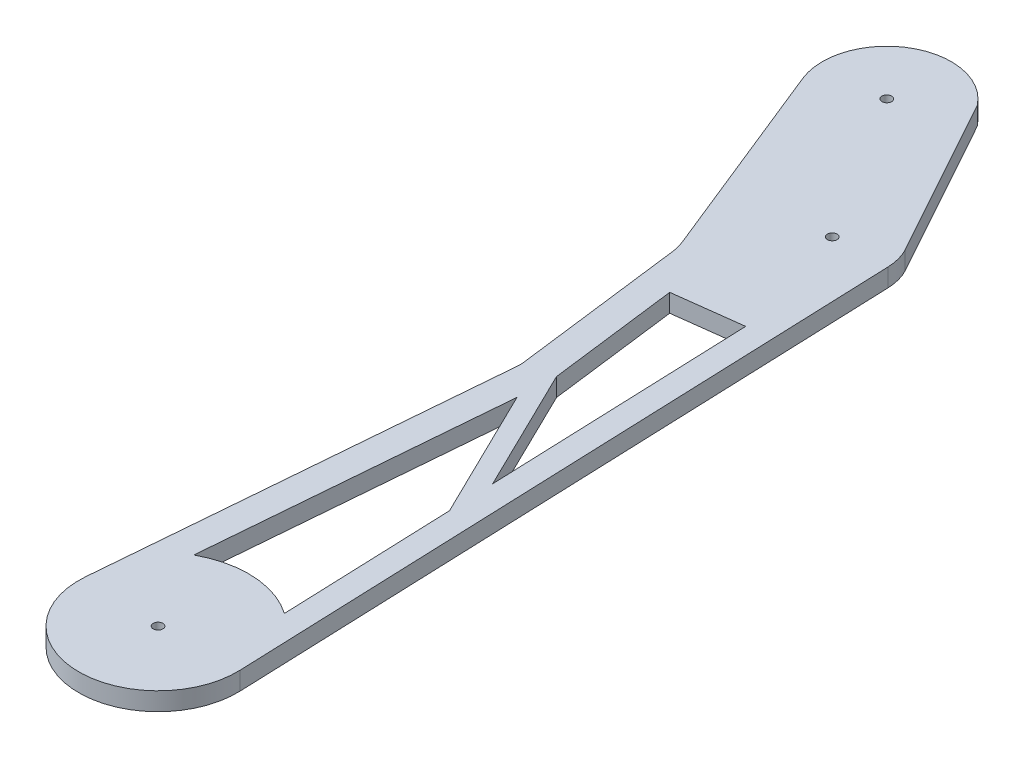
ISO-10303-21;
HEADER;
FILE_DESCRIPTION(('STEP AP214'),'2;1');
FILE_NAME('part.step','',(''),(''),'','','');
FILE_SCHEMA(('AUTOMOTIVE_DESIGN { 1 0 10303 214 1 1 1 1 }'));
ENDSEC;
DATA;
#1=APPLICATION_CONTEXT('core data for automotive mechanical design processes');
#2=APPLICATION_PROTOCOL_DEFINITION('international standard','automotive_design',2000,#1);
#3=PRODUCT_CONTEXT('',#1,'mechanical');
#4=PRODUCT('Part','Part','',(#3));
#5=PRODUCT_RELATED_PRODUCT_CATEGORY('part','',(#4));
#6=PRODUCT_DEFINITION_FORMATION('','',#4);
#7=PRODUCT_DEFINITION_CONTEXT('part definition',#1,'design');
#8=PRODUCT_DEFINITION('design','',#6,#7);
#9=PRODUCT_DEFINITION_SHAPE('','',#8);
#10=(LENGTH_UNIT() NAMED_UNIT(*) SI_UNIT(.MILLI.,.METRE.));
#11=(NAMED_UNIT(*) PLANE_ANGLE_UNIT() SI_UNIT($,.RADIAN.));
#12=(NAMED_UNIT(*) SI_UNIT($,.STERADIAN.) SOLID_ANGLE_UNIT());
#13=UNCERTAINTY_MEASURE_WITH_UNIT(LENGTH_MEASURE(1.E-05),#10,'distance_accuracy_value','');
#14=(GEOMETRIC_REPRESENTATION_CONTEXT(3) GLOBAL_UNCERTAINTY_ASSIGNED_CONTEXT((#13)) GLOBAL_UNIT_ASSIGNED_CONTEXT((#10,
#11,#12)) REPRESENTATION_CONTEXT('',''));
#15=CARTESIAN_POINT('',(0.,0.,0.));
#16=DIRECTION('',(0.,0.,1.));
#17=DIRECTION('',(1.,0.,0.));
#18=AXIS2_PLACEMENT_3D('',#15,#16,#17);
#19=CARTESIAN_POINT('',(25.5027292155976,3.175,-10.2871835645262));
#20=DIRECTION('',(0.927393221665051,0.,-0.374087974158108));
#21=DIRECTION('',(-0.374087974158108,0.,-0.927393221665051));
#22=AXIS2_PLACEMENT_3D('',#19,#20,#21);
#23=PLANE('',#22);
#24=DIRECTION('',(0.374087974158108,0.,0.927393221665051));
#25=VECTOR('',#24,1.);
#26=CARTESIAN_POINT('',(25.5027292155976,0.,-10.2871835645262));
#27=LINE('',#26,#25);
#28=CARTESIAN_POINT('',(-26.6183550992122,0.,-139.499410736945));
#29=VERTEX_POINT('',#28);
#30=CARTESIAN_POINT('',(-12.3575467128305,0.,-104.145756124661));
#31=VERTEX_POINT('',#30);
#32=EDGE_CURVE('E254',#29,#31,#27,.T.);
#33=ORIENTED_EDGE('',*,*,#32,.T.);
#34=DIRECTION('',(0.,-1.,0.));
#35=VECTOR('',#34,1.);
#36=CARTESIAN_POINT('',(-12.3575467128305,3.175,-104.145756124661));
#37=LINE('',#36,#35);
#38=CARTESIAN_POINT('',(-12.3575467128305,3.175,-104.145756124661));
#39=VERTEX_POINT('',#38);
#40=EDGE_CURVE('E11',#39,#31,#37,.T.);
#41=ORIENTED_EDGE('',*,*,#40,.F.);
#42=DIRECTION('',(0.374087974158108,0.,0.927393221665051));
#43=VECTOR('',#42,1.);
#44=CARTESIAN_POINT('',(25.5027292155976,3.175,-10.2871835645262));
#45=LINE('',#44,#43);
#46=CARTESIAN_POINT('',(-26.6183550992122,3.175,-139.499410736945));
#47=VERTEX_POINT('',#46);
#48=EDGE_CURVE('E460',#47,#39,#45,.T.);
#49=ORIENTED_EDGE('',*,*,#48,.F.);
#50=DIRECTION('',(0.,-1.,0.));
#51=VECTOR('',#50,1.);
#52=CARTESIAN_POINT('',(-26.6183550992122,3.175,-139.499410736945));
#53=LINE('',#52,#51);
#54=EDGE_CURVE('E67',#47,#29,#53,.T.);
#55=ORIENTED_EDGE('',*,*,#54,.T.);
#56=EDGE_LOOP('',(#33,#41,#49,#55));
#57=FACE_BOUND('',#56,.T.);
#58=ADVANCED_FACE('F47',(#57),#23,.F.);
#59=CARTESIAN_POINT('',(-21.1520677234773,3.175,-100.598259257413));
#60=DIRECTION('',(0.,-1.,0.));
#61=DIRECTION('',(0.,0.,-1.));
#62=AXIS2_PLACEMENT_3D('',#59,#60,#61);
#63=CYLINDRICAL_SURFACE('',#62,9.48305508946575);
#64=CARTESIAN_POINT('',(-21.1520677234773,0.,-100.598259257413));
#65=DIRECTION('',(0.,1.,0.));
#66=DIRECTION('',(0.,0.,1.));
#67=AXIS2_PLACEMENT_3D('',#64,#65,#66);
#68=CIRCLE('',#67,9.48305508946575);
#69=CARTESIAN_POINT('',(-11.7435795270454,0.,-101.785139069123));
#70=VERTEX_POINT('',#69);
#71=EDGE_CURVE('E257',#31,#70,#68,.F.);
#72=ORIENTED_EDGE('',*,*,#71,.T.);
#73=DIRECTION('',(0.,-1.,0.));
#74=VECTOR('',#73,1.);
#75=CARTESIAN_POINT('',(-11.7435795270454,3.175,-101.785139069123));
#76=LINE('',#75,#74);
#77=CARTESIAN_POINT('',(-11.7435795270454,3.175,-101.785139069123));
#78=VERTEX_POINT('',#77);
#79=EDGE_CURVE('E58',#78,#70,#76,.T.);
#80=ORIENTED_EDGE('',*,*,#79,.F.);
#81=CARTESIAN_POINT('',(-21.1520677234773,3.175,-100.598259257413));
#82=DIRECTION('',(0.,1.,0.));
#83=DIRECTION('',(0.,0.,1.));
#84=AXIS2_PLACEMENT_3D('',#81,#82,#83);
#85=CIRCLE('',#84,9.48305508946575);
#86=EDGE_CURVE('E451',#39,#78,#85,.F.);
#87=ORIENTED_EDGE('',*,*,#86,.F.);
#88=ORIENTED_EDGE('',*,*,#40,.T.);
#89=EDGE_LOOP('',(#72,#80,#87,#88));
#90=FACE_BOUND('',#89,.T.);
#91=ADVANCED_FACE('F365',(#90),#63,.F.);
#92=CARTESIAN_POINT('',(1.07942743799077,3.175,-0.136169659525342));
#93=DIRECTION('',(0.992136828023214,0.,-0.125157958117078));
#94=DIRECTION('',(-0.125157958117078,0.,-0.992136828023214));
#95=AXIS2_PLACEMENT_3D('',#92,#93,#94);
#96=PLANE('',#95);
#97=DIRECTION('',(0.125157958117078,0.,0.992136828023214));
#98=VECTOR('',#97,1.);
#99=CARTESIAN_POINT('',(1.07942743799077,0.,-0.136169659525342));
#100=LINE('',#99,#98);
#101=CARTESIAN_POINT('',(-7.99527824016629,0.,-72.0720644457673));
#102=VERTEX_POINT('',#101);
#103=EDGE_CURVE('E260',#70,#102,#100,.T.);
#104=ORIENTED_EDGE('',*,*,#103,.T.);
#105=DIRECTION('',(0.,-1.,0.));
#106=VECTOR('',#105,1.);
#107=CARTESIAN_POINT('',(-7.99527824016629,3.175,-72.0720644457673));
#108=LINE('',#107,#106);
#109=CARTESIAN_POINT('',(-7.99527824016629,3.175,-72.0720644457673));
#110=VERTEX_POINT('',#109);
#111=EDGE_CURVE('E306',#110,#102,#108,.T.);
#112=ORIENTED_EDGE('',*,*,#111,.F.);
#113=DIRECTION('',(0.125157958117078,0.,0.992136828023214));
#114=VECTOR('',#113,1.);
#115=CARTESIAN_POINT('',(1.07942743799077,3.175,-0.136169659525342));
#116=LINE('',#115,#114);
#117=EDGE_CURVE('E445',#78,#110,#116,.T.);
#118=ORIENTED_EDGE('',*,*,#117,.F.);
#119=ORIENTED_EDGE('',*,*,#79,.T.);
#120=EDGE_LOOP('',(#104,#112,#118,#119));
#121=FACE_BOUND('',#120,.T.);
#122=ADVANCED_FACE('F370',(#121),#96,.F.);
#123=CARTESIAN_POINT('',(-14.2953470981137,3.175,-71.2773114117238));
#124=DIRECTION('',(0.,-1.,0.));
#125=DIRECTION('',(0.,0.,-1.));
#126=AXIS2_PLACEMENT_3D('',#123,#124,#125);
#127=CYLINDRICAL_SURFACE('',#126,6.35);
#128=CARTESIAN_POINT('',(-14.2953470981137,0.,-71.2773114117238));
#129=DIRECTION('',(0.,1.,0.));
#130=DIRECTION('',(0.,0.,1.));
#131=AXIS2_PLACEMENT_3D('',#128,#129,#130);
#132=CIRCLE('',#131,6.35);
#133=CARTESIAN_POINT('',(-7.96771141316416,0.,-70.7448392166252));
#134=VERTEX_POINT('',#133);
#135=EDGE_CURVE('E264',#134,#102,#132,.T.);
#136=ORIENTED_EDGE('',*,*,#135,.F.);
#137=DIRECTION('',(0.,-1.,0.));
#138=VECTOR('',#137,1.);
#139=CARTESIAN_POINT('',(-7.96771141316416,3.175,-70.7448392166252));
#140=LINE('',#139,#138);
#141=CARTESIAN_POINT('',(-7.96771141316416,3.175,-70.7448392166252));
#142=VERTEX_POINT('',#141);
#143=EDGE_CURVE('E303',#142,#134,#140,.T.);
#144=ORIENTED_EDGE('',*,*,#143,.F.);
#145=CARTESIAN_POINT('',(-14.2953470981137,3.175,-71.2773114117238));
#146=DIRECTION('',(0.,1.,0.));
#147=DIRECTION('',(0.,0.,1.));
#148=AXIS2_PLACEMENT_3D('',#145,#146,#147);
#149=CIRCLE('',#148,6.35);
#150=EDGE_CURVE('E442',#142,#110,#149,.T.);
#151=ORIENTED_EDGE('',*,*,#150,.T.);
#152=ORIENTED_EDGE('',*,*,#111,.T.);
#153=EDGE_LOOP('',(#136,#144,#151,#152));
#154=FACE_BOUND('',#153,.T.);
#155=ADVANCED_FACE('F423',(#154),#127,.F.);
#156=CARTESIAN_POINT('',(-13.82302359231,3.175,-1.16321104462518));
#157=DIRECTION('',(0.996478060621975,0.,0.0838538889919131));
#158=DIRECTION('',(0.0838538889919131,0.,-0.996478060621975));
#159=AXIS2_PLACEMENT_3D('',#156,#157,#158);
#160=PLANE('',#159);
#161=DIRECTION('',(-0.083853888991913,0.,0.996478060621975));
#162=VECTOR('',#161,1.);
#163=CARTESIAN_POINT('',(-13.82302359231,0.,-1.16321104462518));
#164=LINE('',#163,#162);
#165=CARTESIAN_POINT('',(-13.82302359231,0.,-1.16321104462518));
#166=VERTEX_POINT('',#165);
#167=EDGE_CURVE('E268',#134,#166,#164,.T.);
#168=ORIENTED_EDGE('',*,*,#167,.T.);
#169=DIRECTION('',(0.,-1.,0.));
#170=VECTOR('',#169,1.);
#171=CARTESIAN_POINT('',(-13.82302359231,3.175,-1.16321104462518));
#172=LINE('',#171,#170);
#173=CARTESIAN_POINT('',(-13.82302359231,3.175,-1.16321104462518));
#174=VERTEX_POINT('',#173);
#175=EDGE_CURVE('E299',#174,#166,#172,.T.);
#176=ORIENTED_EDGE('',*,*,#175,.F.);
#177=DIRECTION('',(-0.083853888991913,0.,0.996478060621975));
#178=VECTOR('',#177,1.);
#179=CARTESIAN_POINT('',(-13.82302359231,3.175,-1.16321104462518));
#180=LINE('',#179,#178);
#181=EDGE_CURVE('E444',#142,#174,#180,.T.);
#182=ORIENTED_EDGE('',*,*,#181,.F.);
#183=ORIENTED_EDGE('',*,*,#143,.T.);
#184=EDGE_LOOP('',(#168,#176,#182,#183));
#185=FACE_BOUND('',#184,.T.);
#186=ADVANCED_FACE('F419',(#185),#160,.F.);
#187=CARTESIAN_POINT('',(0.,3.175,0.));
#188=DIRECTION('',(0.,-1.,0.));
#189=DIRECTION('',(0.,0.,-1.));
#190=AXIS2_PLACEMENT_3D('',#187,#188,#189);
#191=CYLINDRICAL_SURFACE('',#190,13.871879511007);
#192=CARTESIAN_POINT('',(0.,0.,0.));
#193=DIRECTION('',(0.,1.,0.));
#194=DIRECTION('',(0.,0.,1.));
#195=AXIS2_PLACEMENT_3D('',#192,#193,#194);
#196=CIRCLE('',#195,13.871879511007);
#197=CARTESIAN_POINT('',(13.8621224142897,0.,-0.520195481662794));
#198=VERTEX_POINT('',#197);
#199=EDGE_CURVE('E271',#166,#198,#196,.T.);
#200=ORIENTED_EDGE('',*,*,#199,.T.);
#201=DIRECTION('',(0.,-1.,0.));
#202=VECTOR('',#201,1.);
#203=CARTESIAN_POINT('',(13.8621224142897,3.175,-0.520195481662794));
#204=LINE('',#203,#202);
#205=CARTESIAN_POINT('',(13.8621224142897,3.175,-0.520195481662794));
#206=VERTEX_POINT('',#205);
#207=EDGE_CURVE('E296',#206,#198,#204,.T.);
#208=ORIENTED_EDGE('',*,*,#207,.F.);
#209=CARTESIAN_POINT('',(0.,3.175,0.));
#210=DIRECTION('',(0.,1.,0.));
#211=DIRECTION('',(0.,0.,1.));
#212=AXIS2_PLACEMENT_3D('',#209,#210,#211);
#213=CIRCLE('',#212,13.871879511007);
#214=EDGE_CURVE('E449',#174,#206,#213,.T.);
#215=ORIENTED_EDGE('',*,*,#214,.F.);
#216=ORIENTED_EDGE('',*,*,#175,.T.);
#217=EDGE_LOOP('',(#200,#208,#215,#216));
#218=FACE_BOUND('',#217,.T.);
#219=ADVANCED_FACE('F415',(#218),#191,.T.);
#220=CARTESIAN_POINT('',(13.8621224142897,3.175,-0.520195481662794));
#221=DIRECTION('',(0.999296627633657,0.,-0.0375000000000022));
#222=DIRECTION('',(-0.0375000000000022,0.,-0.999296627633657));
#223=AXIS2_PLACEMENT_3D('',#220,#221,#222);
#224=PLANE('',#223);
#225=DIRECTION('',(0.0375000000000022,0.,0.999296627633657));
#226=VECTOR('',#225,1.);
#227=CARTESIAN_POINT('',(13.8621224142897,0.,-0.520195481662794));
#228=LINE('',#227,#226);
#229=CARTESIAN_POINT('',(9.4394116017196,0.,-118.376195481663));
#230=VERTEX_POINT('',#229);
#231=EDGE_CURVE('E275',#230,#198,#228,.T.);
#232=ORIENTED_EDGE('',*,*,#231,.F.);
#233=DIRECTION('',(0.,-1.,0.));
#234=VECTOR('',#233,1.);
#235=CARTESIAN_POINT('',(9.4394116017196,3.175,-118.376195481663));
#236=LINE('',#235,#234);
#237=CARTESIAN_POINT('',(9.4394116017196,3.175,-118.376195481663));
#238=VERTEX_POINT('',#237);
#239=EDGE_CURVE('E192',#238,#230,#236,.T.);
#240=ORIENTED_EDGE('',*,*,#239,.F.);
#241=DIRECTION('',(0.0375000000000022,0.,0.999296627633657));
#242=VECTOR('',#241,1.);
#243=CARTESIAN_POINT('',(13.8621224142897,3.175,-0.520195481662794));
#244=LINE('',#243,#242);
#245=EDGE_CURVE('E202',#238,#206,#244,.T.);
#246=ORIENTED_EDGE('',*,*,#245,.T.);
#247=ORIENTED_EDGE('',*,*,#207,.T.);
#248=EDGE_LOOP('',(#232,#240,#246,#247));
#249=FACE_BOUND('',#248,.T.);
#250=ADVANCED_FACE('F412',(#249),#224,.T.);
#251=CARTESIAN_POINT('',(0.,3.175,-118.021968393053));
#252=DIRECTION('',(0.,-1.,0.));
#253=DIRECTION('',(0.,0.,-1.));
#254=AXIS2_PLACEMENT_3D('',#251,#252,#253);
#255=CYLINDRICAL_SURFACE('',#254,9.44605569626729);
#256=CARTESIAN_POINT('',(0.,0.,-118.021968393053));
#257=DIRECTION('',(0.,1.,0.));
#258=DIRECTION('',(0.,0.,1.));
#259=AXIS2_PLACEMENT_3D('',#256,#257,#258);
#260=CIRCLE('',#259,9.44605569626729);
#261=CARTESIAN_POINT('',(8.36793241451558,0.,-122.404396409927));
#262=VERTEX_POINT('',#261);
#263=EDGE_CURVE('E187',#262,#230,#260,.F.);
#264=ORIENTED_EDGE('',*,*,#263,.F.);
#265=DIRECTION('',(0.,-1.,0.));
#266=VECTOR('',#265,1.);
#267=CARTESIAN_POINT('',(8.36793241451558,3.175,-122.404396409927));
#268=LINE('',#267,#266);
#269=CARTESIAN_POINT('',(8.36793241451558,3.175,-122.404396409927));
#270=VERTEX_POINT('',#269);
#271=EDGE_CURVE('E182',#270,#262,#268,.T.);
#272=ORIENTED_EDGE('',*,*,#271,.F.);
#273=CARTESIAN_POINT('',(0.,3.175,-118.021968393053));
#274=DIRECTION('',(0.,1.,0.));
#275=DIRECTION('',(0.,0.,1.));
#276=AXIS2_PLACEMENT_3D('',#273,#274,#275);
#277=CIRCLE('',#276,9.44605569626729);
#278=EDGE_CURVE('E185',#270,#238,#277,.F.);
#279=ORIENTED_EDGE('',*,*,#278,.T.);
#280=ORIENTED_EDGE('',*,*,#239,.T.);
#281=EDGE_LOOP('',(#264,#272,#279,#280));
#282=FACE_BOUND('',#281,.T.);
#283=ADVANCED_FACE('F184',(#282),#255,.T.);
#284=CARTESIAN_POINT('',(58.2403035348906,3.175,-32.2000080624195));
#285=DIRECTION('',(0.875148788818419,0.,-0.483853900913957));
#286=DIRECTION('',(-0.483853900913957,0.,-0.875148788818419));
#287=AXIS2_PLACEMENT_3D('',#284,#285,#286);
#288=PLANE('',#287);
#289=DIRECTION('',(0.483853900913957,0.,0.875148788818419));
#290=VECTOR('',#289,1.);
#291=CARTESIAN_POINT('',(58.2403035348906,0.,-32.2000080624195));
#292=LINE('',#291,#290);
#293=CARTESIAN_POINT('',(-7.27820625378067,0.,-150.703639795958));
#294=VERTEX_POINT('',#293);
#295=EDGE_CURVE('E281',#294,#262,#292,.T.);
#296=ORIENTED_EDGE('',*,*,#295,.F.);
#297=DIRECTION('',(0.,-1.,0.));
#298=VECTOR('',#297,1.);
#299=CARTESIAN_POINT('',(-7.27820625378067,3.175,-150.703639795958));
#300=LINE('',#299,#298);
#301=CARTESIAN_POINT('',(-7.27820625378067,3.175,-150.703639795958));
#302=VERTEX_POINT('',#301);
#303=EDGE_CURVE('E123',#302,#294,#300,.T.);
#304=ORIENTED_EDGE('',*,*,#303,.F.);
#305=DIRECTION('',(0.483853900913957,0.,0.875148788818419));
#306=VECTOR('',#305,1.);
#307=CARTESIAN_POINT('',(58.2403035348906,3.175,-32.2000080624195));
#308=LINE('',#307,#306);
#309=EDGE_CURVE('E200',#302,#270,#308,.T.);
#310=ORIENTED_EDGE('',*,*,#309,.T.);
#311=ORIENTED_EDGE('',*,*,#271,.T.);
#312=EDGE_LOOP('',(#296,#304,#310,#311));
#313=FACE_BOUND('',#312,.T.);
#314=ADVANCED_FACE('F205',(#313),#288,.T.);
#315=CARTESIAN_POINT('',(26.2826811214349,3.175,-12.8346230388663));
#316=DIRECTION('',(0.89858241194009,0.,-0.438804795953658));
#317=DIRECTION('',(-0.438804795953658,0.,-0.89858241194009));
#318=AXIS2_PLACEMENT_3D('',#315,#316,#317);
#319=PLANE('',#318);
#320=DIRECTION('',(0.438804795953658,0.,0.89858241194009));
#321=VECTOR('',#320,1.);
#322=CARTESIAN_POINT('',(26.2826811214349,0.,-12.8346230388663));
#323=LINE('',#322,#321);
#324=CARTESIAN_POINT('',(-2.95522315380836,0.,-72.707866873002));
#325=VERTEX_POINT('',#324);
#326=CARTESIAN_POINT('',(7.7186110597425,0.,-50.8500390171867));
#327=VERTEX_POINT('',#326);
#328=EDGE_CURVE('E230',#325,#327,#323,.T.);
#329=ORIENTED_EDGE('',*,*,#328,.F.);
#330=DIRECTION('',(0.,-1.,0.));
#331=VECTOR('',#330,1.);
#332=CARTESIAN_POINT('',(-2.95522315380836,3.175,-72.707866873002));
#333=LINE('',#332,#331);
#334=CARTESIAN_POINT('',(-2.95522315380836,3.175,-72.707866873002));
#335=VERTEX_POINT('',#334);
#336=EDGE_CURVE('E291',#335,#325,#333,.T.);
#337=ORIENTED_EDGE('',*,*,#336,.F.);
#338=DIRECTION('',(0.438804795953658,0.,0.89858241194009));
#339=VECTOR('',#338,1.);
#340=CARTESIAN_POINT('',(26.2826811214349,3.175,-12.8346230388663));
#341=LINE('',#340,#339);
#342=CARTESIAN_POINT('',(7.7186110597425,3.175,-50.8500390171867));
#343=VERTEX_POINT('',#342);
#344=EDGE_CURVE('E486',#335,#343,#341,.T.);
#345=ORIENTED_EDGE('',*,*,#344,.T.);
#346=DIRECTION('',(0.,-1.,0.));
#347=VECTOR('',#346,1.);
#348=CARTESIAN_POINT('',(7.7186110597425,3.175,-50.8500390171867));
#349=LINE('',#348,#347);
#350=EDGE_CURVE('E312',#343,#327,#349,.T.);
#351=ORIENTED_EDGE('',*,*,#350,.T.);
#352=EDGE_LOOP('',(#329,#337,#345,#351));
#353=FACE_BOUND('',#352,.T.);
#354=ADVANCED_FACE('F391',(#353),#319,.T.);
#355=CARTESIAN_POINT('',(6.11948252434875,3.175,-0.771972086760109));
#356=DIRECTION('',(-0.992136828023214,0.,0.125157958117079));
#357=DIRECTION('',(0.125157958117079,0.,0.992136828023214));
#358=AXIS2_PLACEMENT_3D('',#355,#356,#357);
#359=PLANE('',#358);
#360=DIRECTION('',(-0.125157958117079,0.,-0.992136828023214));
#361=VECTOR('',#360,1.);
#362=CARTESIAN_POINT('',(6.11948252434875,0.,-0.771972086760109));
#363=LINE('',#362,#361);
#364=CARTESIAN_POINT('',(-5.81633407636478,0.,-95.3881147616127));
#365=VERTEX_POINT('',#364);
#366=EDGE_CURVE('E234',#325,#365,#363,.T.);
#367=ORIENTED_EDGE('',*,*,#366,.T.);
#368=DIRECTION('',(0.,-1.,0.));
#369=VECTOR('',#368,1.);
#370=CARTESIAN_POINT('',(-5.81633407636478,3.175,-95.3881147616127));
#371=LINE('',#370,#369);
#372=CARTESIAN_POINT('',(-5.81633407636478,3.175,-95.3881147616127));
#373=VERTEX_POINT('',#372);
#374=EDGE_CURVE('E319',#373,#365,#371,.T.);
#375=ORIENTED_EDGE('',*,*,#374,.F.);
#376=DIRECTION('',(-0.125157958117079,0.,-0.992136828023214));
#377=VECTOR('',#376,1.);
#378=CARTESIAN_POINT('',(6.11948252434875,3.175,-0.771972086760109));
#379=LINE('',#378,#377);
#380=EDGE_CURVE('E482',#335,#373,#379,.T.);
#381=ORIENTED_EDGE('',*,*,#380,.F.);
#382=ORIENTED_EDGE('',*,*,#336,.T.);
#383=EDGE_LOOP('',(#367,#375,#381,#382));
#384=FACE_BOUND('',#383,.T.);
#385=ADVANCED_FACE('F387',(#384),#359,.F.);
#386=CARTESIAN_POINT('',(-11.9358166007135,3.175,-94.6161426748526));
#387=DIRECTION('',(-0.125157958117078,0.,-0.992136828023214));
#388=DIRECTION('',(-0.992136828023214,0.,0.125157958117078));
#389=AXIS2_PLACEMENT_3D('',#386,#387,#388);
#390=PLANE('',#389);
#391=DIRECTION('',(0.992136828023214,0.,-0.125157958117078));
#392=VECTOR('',#391,1.);
#393=CARTESIAN_POINT('',(-11.9358166007135,0.,-94.6161426748526));
#394=LINE('',#393,#392);
#395=CARTESIAN_POINT('',(5.99136058934958,0.,-96.8776542209786));
#396=VERTEX_POINT('',#395);
#397=EDGE_CURVE('E238',#365,#396,#394,.T.);
#398=ORIENTED_EDGE('',*,*,#397,.T.);
#399=DIRECTION('',(0.,-1.,0.));
#400=VECTOR('',#399,1.);
#401=CARTESIAN_POINT('',(5.99136058934958,3.175,-96.8776542209786));
#402=LINE('',#401,#400);
#403=CARTESIAN_POINT('',(5.99136058934958,3.175,-96.8776542209786));
#404=VERTEX_POINT('',#403);
#405=EDGE_CURVE('E315',#404,#396,#402,.T.);
#406=ORIENTED_EDGE('',*,*,#405,.F.);
#407=DIRECTION('',(0.992136828023214,0.,-0.125157958117078));
#408=VECTOR('',#407,1.);
#409=CARTESIAN_POINT('',(-11.9358166007135,3.175,-94.6161426748526));
#410=LINE('',#409,#408);
#411=EDGE_CURVE('E478',#373,#404,#410,.T.);
#412=ORIENTED_EDGE('',*,*,#411,.F.);
#413=ORIENTED_EDGE('',*,*,#374,.T.);
#414=EDGE_LOOP('',(#398,#406,#412,#413));
#415=FACE_BOUND('',#414,.T.);
#416=ADVANCED_FACE('F384',(#415),#390,.F.);
#417=CARTESIAN_POINT('',(23.4296819635251,3.175,-11.4414178117134));
#418=DIRECTION('',(0.89858241194009,0.,-0.438804795953657));
#419=DIRECTION('',(-0.438804795953657,0.,-0.89858241194009));
#420=AXIS2_PLACEMENT_3D('',#417,#418,#419);
#421=PLANE('',#420);
#422=DIRECTION('',(0.438804795953658,0.,0.89858241194009));
#423=VECTOR('',#422,1.);
#424=CARTESIAN_POINT('',(23.4296819635251,0.,-11.4414178117134));
#425=LINE('',#424,#423);
#426=CARTESIAN_POINT('',(-3.2607865487238,0.,-66.0980345868877));
#427=VERTEX_POINT('',#426);
#428=CARTESIAN_POINT('',(8.01273828864583,0.,-43.0121630721653));
#429=VERTEX_POINT('',#428);
#430=EDGE_CURVE('E214',#427,#429,#425,.T.);
#431=ORIENTED_EDGE('',*,*,#430,.T.);
#432=DIRECTION('',(0.,-1.,0.));
#433=VECTOR('',#432,1.);
#434=CARTESIAN_POINT('',(8.01273828864583,3.175,-43.0121630721653));
#435=LINE('',#434,#433);
#436=CARTESIAN_POINT('',(8.01273828864583,3.175,-43.0121630721653));
#437=VERTEX_POINT('',#436);
#438=EDGE_CURVE('E51',#437,#429,#435,.T.);
#439=ORIENTED_EDGE('',*,*,#438,.F.);
#440=DIRECTION('',(0.438804795953658,0.,0.89858241194009));
#441=VECTOR('',#440,1.);
#442=CARTESIAN_POINT('',(23.4296819635251,3.175,-11.4414178117134));
#443=LINE('',#442,#441);
#444=CARTESIAN_POINT('',(-3.2607865487238,3.175,-66.0980345868877));
#445=VERTEX_POINT('',#444);
#446=EDGE_CURVE('E288',#445,#437,#443,.T.);
#447=ORIENTED_EDGE('',*,*,#446,.F.);
#448=DIRECTION('',(0.,-1.,0.));
#449=VECTOR('',#448,1.);
#450=CARTESIAN_POINT('',(-3.2607865487238,3.175,-66.0980345868877));
#451=LINE('',#450,#449);
#452=EDGE_CURVE('E210',#445,#427,#451,.T.);
#453=ORIENTED_EDGE('',*,*,#452,.T.);
#454=EDGE_LOOP('',(#431,#439,#447,#453));
#455=FACE_BOUND('',#454,.T.);
#456=ADVANCED_FACE('F49',(#455),#421,.F.);
#457=CARTESIAN_POINT('',(9.61329198187415,3.175,-0.360752192443564));
#458=DIRECTION('',(0.999296627633657,0.,-0.0375000000000022));
#459=DIRECTION('',(-0.0375000000000022,0.,-0.999296627633657));
#460=AXIS2_PLACEMENT_3D('',#457,#458,#459);
#461=PLANE('',#460);
#462=DIRECTION('',(0.0375000000000022,0.,0.999296627633657));
#463=VECTOR('',#462,1.);
#464=CARTESIAN_POINT('',(9.61329198187415,0.,-0.360752192443564));
#465=LINE('',#464,#463);
#466=CARTESIAN_POINT('',(9.13973646421708,0.,-12.98001704023));
#467=VERTEX_POINT('',#466);
#468=EDGE_CURVE('E218',#429,#467,#465,.T.);
#469=ORIENTED_EDGE('',*,*,#468,.T.);
#470=DIRECTION('',(0.,-1.,0.));
#471=VECTOR('',#470,1.);
#472=CARTESIAN_POINT('',(9.13973646421708,3.175,-12.98001704023));
#473=LINE('',#472,#471);
#474=CARTESIAN_POINT('',(9.13973646421708,3.175,-12.98001704023));
#475=VERTEX_POINT('',#474);
#476=EDGE_CURVE('E329',#475,#467,#473,.T.);
#477=ORIENTED_EDGE('',*,*,#476,.F.);
#478=DIRECTION('',(0.0375000000000022,0.,0.999296627633657));
#479=VECTOR('',#478,1.);
#480=CARTESIAN_POINT('',(9.61329198187415,3.175,-0.360752192443564));
#481=LINE('',#480,#479);
#482=EDGE_CURVE('E136',#437,#475,#481,.T.);
#483=ORIENTED_EDGE('',*,*,#482,.F.);
#484=ORIENTED_EDGE('',*,*,#438,.T.);
#485=EDGE_LOOP('',(#469,#477,#483,#484));
#486=FACE_BOUND('',#485,.T.);
#487=ADVANCED_FACE('F337',(#486),#461,.F.);
#488=CARTESIAN_POINT('',(0.,3.175,0.));
#489=DIRECTION('',(0.,-1.,0.));
#490=DIRECTION('',(0.,0.,-1.));
#491=AXIS2_PLACEMENT_3D('',#488,#489,#490);
#492=CYLINDRICAL_SURFACE('',#491,15.875);
#493=CARTESIAN_POINT('',(0.,0.,0.));
#494=DIRECTION('',(0.,1.,0.));
#495=DIRECTION('',(0.,0.,1.));
#496=AXIS2_PLACEMENT_3D('',#493,#494,#495);
#497=CIRCLE('',#496,15.875);
#498=CARTESIAN_POINT('',(-7.65252496445217,0.,-13.9087917041142));
#499=VERTEX_POINT('',#498);
#500=EDGE_CURVE('E221',#467,#499,#497,.T.);
#501=ORIENTED_EDGE('',*,*,#500,.T.);
#502=DIRECTION('',(0.,-1.,0.));
#503=VECTOR('',#502,1.);
#504=CARTESIAN_POINT('',(-7.65252496445217,3.175,-13.9087917041142));
#505=LINE('',#504,#503);
#506=CARTESIAN_POINT('',(-7.65252496445217,3.175,-13.9087917041142));
#507=VERTEX_POINT('',#506);
#508=EDGE_CURVE('E327',#507,#499,#505,.T.);
#509=ORIENTED_EDGE('',*,*,#508,.F.);
#510=CARTESIAN_POINT('',(0.,3.175,0.));
#511=DIRECTION('',(0.,1.,0.));
#512=DIRECTION('',(0.,0.,1.));
#513=AXIS2_PLACEMENT_3D('',#510,#511,#512);
#514=CIRCLE('',#513,15.875);
#515=EDGE_CURVE('E492',#475,#507,#514,.T.);
#516=ORIENTED_EDGE('',*,*,#515,.F.);
#517=ORIENTED_EDGE('',*,*,#476,.T.);
#518=EDGE_LOOP('',(#501,#509,#516,#517));
#519=FACE_BOUND('',#518,.T.);
#520=ADVANCED_FACE('F351',(#519),#492,.T.);
#521=CARTESIAN_POINT('',(-16.1493033452062,3.175,-143.722372766989));
#522=DIRECTION('',(0.,-1.,0.));
#523=DIRECTION('',(0.,0.,-1.));
#524=AXIS2_PLACEMENT_3D('',#521,#522,#523);
#525=CYLINDRICAL_SURFACE('',#524,0.850900000000008);
#526=CARTESIAN_POINT('',(-16.1493033452062,3.175,-143.722372766989));
#527=DIRECTION('',(0.,1.,0.));
#528=DIRECTION('',(0.,0.,1.));
#529=AXIS2_PLACEMENT_3D('',#526,#527,#528);
#530=CIRCLE('',#529,0.850900000000008);
#531=CARTESIAN_POINT('',(-16.1493033452062,3.175,-142.871472766989));
#532=VERTEX_POINT('',#531);
#533=EDGE_CURVE('E463',#532,#532,#530,.T.);
#534=ORIENTED_EDGE('',*,*,#533,.T.);
#535=EDGE_LOOP('',(#534));
#536=FACE_BOUND('',#535,.T.);
#537=CARTESIAN_POINT('',(-16.1493033452062,0.,-143.722372766989));
#538=DIRECTION('',(0.,1.,0.));
#539=DIRECTION('',(0.,0.,1.));
#540=AXIS2_PLACEMENT_3D('',#537,#538,#539);
#541=CIRCLE('',#540,0.850900000000008);
#542=CARTESIAN_POINT('',(-16.1493033452062,0.,-142.871472766989));
#543=VERTEX_POINT('',#542);
#544=EDGE_CURVE('E250',#543,#543,#541,.T.);
#545=ORIENTED_EDGE('',*,*,#544,.F.);
#546=EDGE_LOOP('',(#545));
#547=FACE_BOUND('',#546,.T.);
#548=ADVANCED_FACE('F353',(#536,#547),#525,.F.);
#549=CARTESIAN_POINT('',(0.,3.175,-118.021968393053));
#550=DIRECTION('',(0.,-1.,0.));
#551=DIRECTION('',(0.,0.,-1.));
#552=AXIS2_PLACEMENT_3D('',#549,#550,#551);
#553=CYLINDRICAL_SURFACE('',#552,0.850899999999999);
#554=CARTESIAN_POINT('',(0.,3.175,-118.021968393053));
#555=DIRECTION('',(0.,1.,0.));
#556=DIRECTION('',(0.,0.,1.));
#557=AXIS2_PLACEMENT_3D('',#554,#555,#556);
#558=CIRCLE('',#557,0.850899999999999);
#559=CARTESIAN_POINT('',(0.,3.175,-117.171068393053));
#560=VERTEX_POINT('',#559);
#561=EDGE_CURVE('E467',#560,#560,#558,.T.);
#562=ORIENTED_EDGE('',*,*,#561,.T.);
#563=EDGE_LOOP('',(#562));
#564=FACE_BOUND('',#563,.T.);
#565=CARTESIAN_POINT('',(0.,0.,-118.021968393053));
#566=DIRECTION('',(0.,1.,0.));
#567=DIRECTION('',(0.,0.,1.));
#568=AXIS2_PLACEMENT_3D('',#565,#566,#567);
#569=CIRCLE('',#568,0.850899999999999);
#570=CARTESIAN_POINT('',(0.,0.,-117.171068393053));
#571=VERTEX_POINT('',#570);
#572=EDGE_CURVE('E246',#571,#571,#569,.T.);
#573=ORIENTED_EDGE('',*,*,#572,.F.);
#574=EDGE_LOOP('',(#573));
#575=FACE_BOUND('',#574,.T.);
#576=ADVANCED_FACE('F358',(#564,#575),#553,.F.);
#577=CARTESIAN_POINT('',(0.,3.175,0.));
#578=DIRECTION('',(0.,-1.,0.));
#579=DIRECTION('',(0.,0.,-1.));
#580=AXIS2_PLACEMENT_3D('',#577,#578,#579);
#581=CYLINDRICAL_SURFACE('',#580,0.8509);
#582=CARTESIAN_POINT('',(0.,3.175,0.));
#583=DIRECTION('',(0.,1.,0.));
#584=DIRECTION('',(0.,0.,1.));
#585=AXIS2_PLACEMENT_3D('',#582,#583,#584);
#586=CIRCLE('',#585,0.8509);
#587=CARTESIAN_POINT('',(0.,3.175,0.8509));
#588=VERTEX_POINT('',#587);
#589=EDGE_CURVE('E473',#588,#588,#586,.T.);
#590=ORIENTED_EDGE('',*,*,#589,.T.);
#591=EDGE_LOOP('',(#590));
#592=FACE_BOUND('',#591,.T.);
#593=CARTESIAN_POINT('',(0.,0.,0.));
#594=DIRECTION('',(0.,1.,0.));
#595=DIRECTION('',(0.,0.,1.));
#596=AXIS2_PLACEMENT_3D('',#593,#594,#595);
#597=CIRCLE('',#596,0.8509);
#598=CARTESIAN_POINT('',(0.,0.,0.8509));
#599=VERTEX_POINT('',#598);
#600=EDGE_CURVE('E242',#599,#599,#597,.T.);
#601=ORIENTED_EDGE('',*,*,#600,.F.);
#602=EDGE_LOOP('',(#601));
#603=FACE_BOUND('',#602,.T.);
#604=ADVANCED_FACE('F377',(#592,#603),#581,.F.);
#605=EDGE_CURVE('E222',#396,#327,#465,.T.);
#606=ORIENTED_EDGE('',*,*,#605,.T.);
#607=ORIENTED_EDGE('',*,*,#350,.F.);
#608=EDGE_CURVE('E477',#404,#343,#481,.T.);
#609=ORIENTED_EDGE('',*,*,#608,.F.);
#610=ORIENTED_EDGE('',*,*,#405,.T.);
#611=EDGE_LOOP('',(#606,#607,#609,#610));
#612=FACE_BOUND('',#611,.T.);
#613=ADVANCED_FACE('F362',(#612),#461,.F.);
#614=CARTESIAN_POINT('',(-8.7609150443503,3.175,-0.737233288546247));
#615=DIRECTION('',(0.996478060621975,0.,0.0838538889919123));
#616=DIRECTION('',(0.0838538889919124,0.,-0.996478060621975));
#617=AXIS2_PLACEMENT_3D('',#614,#615,#616);
#618=PLANE('',#617);
#619=DIRECTION('',(-0.0838538889919124,0.,0.996478060621975));
#620=VECTOR('',#619,1.);
#621=CARTESIAN_POINT('',(-8.7609150443503,0.,-0.737233288546247));
#622=LINE('',#621,#620);
#623=EDGE_CURVE('E226',#427,#499,#622,.T.);
#624=ORIENTED_EDGE('',*,*,#623,.F.);
#625=ORIENTED_EDGE('',*,*,#452,.F.);
#626=DIRECTION('',(-0.0838538889919124,0.,0.996478060621975));
#627=VECTOR('',#626,1.);
#628=CARTESIAN_POINT('',(-8.7609150443503,3.175,-0.737233288546247));
#629=LINE('',#628,#627);
#630=EDGE_CURVE('E350',#445,#507,#629,.T.);
#631=ORIENTED_EDGE('',*,*,#630,.T.);
#632=ORIENTED_EDGE('',*,*,#508,.T.);
#633=EDGE_LOOP('',(#624,#625,#631,#632));
#634=FACE_BOUND('',#633,.T.);
#635=ADVANCED_FACE('F346',(#634),#618,.T.);
#636=CARTESIAN_POINT('',(-16.1493033452062,3.175,-143.722372766989));
#637=DIRECTION('',(0.,-1.,0.));
#638=DIRECTION('',(0.,0.,-1.));
#639=AXIS2_PLACEMENT_3D('',#636,#637,#638);
#640=CYLINDRICAL_SURFACE('',#639,11.2886869446919);
#641=CARTESIAN_POINT('',(-16.1493033452062,0.,-143.722372766989));
#642=DIRECTION('',(0.,1.,0.));
#643=DIRECTION('',(0.,0.,1.));
#644=AXIS2_PLACEMENT_3D('',#641,#642,#643);
#645=CIRCLE('',#644,11.2886869446919);
#646=EDGE_CURVE('E284',#29,#294,#645,.F.);
#647=ORIENTED_EDGE('',*,*,#646,.F.);
#648=ORIENTED_EDGE('',*,*,#54,.F.);
#649=CARTESIAN_POINT('',(-16.1493033452062,3.175,-143.722372766989));
#650=DIRECTION('',(0.,1.,0.));
#651=DIRECTION('',(0.,0.,1.));
#652=AXIS2_PLACEMENT_3D('',#649,#650,#651);
#653=CIRCLE('',#652,11.2886869446919);
#654=EDGE_CURVE('E207',#47,#302,#653,.F.);
#655=ORIENTED_EDGE('',*,*,#654,.T.);
#656=ORIENTED_EDGE('',*,*,#303,.T.);
#657=EDGE_LOOP('',(#647,#648,#655,#656));
#658=FACE_BOUND('',#657,.T.);
#659=ADVANCED_FACE('F396',(#658),#640,.T.);
#660=CARTESIAN_POINT('',(0.,3.175,0.));
#661=DIRECTION('',(0.,1.,0.));
#662=DIRECTION('',(0.,0.,1.));
#663=AXIS2_PLACEMENT_3D('',#660,#661,#662);
#664=PLANE('',#663);
#665=ORIENTED_EDGE('',*,*,#446,.T.);
#666=ORIENTED_EDGE('',*,*,#482,.T.);
#667=ORIENTED_EDGE('',*,*,#515,.T.);
#668=ORIENTED_EDGE('',*,*,#630,.F.);
#669=EDGE_LOOP('',(#665,#666,#667,#668));
#670=FACE_BOUND('',#669,.T.);
#671=ORIENTED_EDGE('',*,*,#344,.F.);
#672=ORIENTED_EDGE('',*,*,#380,.T.);
#673=ORIENTED_EDGE('',*,*,#411,.T.);
#674=ORIENTED_EDGE('',*,*,#608,.T.);
#675=EDGE_LOOP('',(#671,#672,#673,#674));
#676=FACE_BOUND('',#675,.T.);
#677=ORIENTED_EDGE('',*,*,#589,.F.);
#678=EDGE_LOOP('',(#677));
#679=FACE_BOUND('',#678,.T.);
#680=ORIENTED_EDGE('',*,*,#561,.F.);
#681=EDGE_LOOP('',(#680));
#682=FACE_BOUND('',#681,.T.);
#683=ORIENTED_EDGE('',*,*,#533,.F.);
#684=EDGE_LOOP('',(#683));
#685=FACE_BOUND('',#684,.T.);
#686=ORIENTED_EDGE('',*,*,#48,.T.);
#687=ORIENTED_EDGE('',*,*,#86,.T.);
#688=ORIENTED_EDGE('',*,*,#117,.T.);
#689=ORIENTED_EDGE('',*,*,#150,.F.);
#690=ORIENTED_EDGE('',*,*,#181,.T.);
#691=ORIENTED_EDGE('',*,*,#214,.T.);
#692=ORIENTED_EDGE('',*,*,#245,.F.);
#693=ORIENTED_EDGE('',*,*,#278,.F.);
#694=ORIENTED_EDGE('',*,*,#309,.F.);
#695=ORIENTED_EDGE('',*,*,#654,.F.);
#696=EDGE_LOOP('',(#686,#687,#688,#689,#690,#691,#692,#693,#694,#695));
#697=FACE_BOUND('',#696,.T.);
#698=ADVANCED_FACE('F198',(#670,#676,#679,#682,#685,#697),#664,.T.);
#699=CARTESIAN_POINT('',(0.,0.,0.));
#700=DIRECTION('',(0.,1.,0.));
#701=DIRECTION('',(0.,0.,1.));
#702=AXIS2_PLACEMENT_3D('',#699,#700,#701);
#703=PLANE('',#702);
#704=ORIENTED_EDGE('',*,*,#430,.F.);
#705=ORIENTED_EDGE('',*,*,#623,.T.);
#706=ORIENTED_EDGE('',*,*,#500,.F.);
#707=ORIENTED_EDGE('',*,*,#468,.F.);
#708=EDGE_LOOP('',(#704,#705,#706,#707));
#709=FACE_BOUND('',#708,.T.);
#710=ORIENTED_EDGE('',*,*,#328,.T.);
#711=ORIENTED_EDGE('',*,*,#605,.F.);
#712=ORIENTED_EDGE('',*,*,#397,.F.);
#713=ORIENTED_EDGE('',*,*,#366,.F.);
#714=EDGE_LOOP('',(#710,#711,#712,#713));
#715=FACE_BOUND('',#714,.T.);
#716=ORIENTED_EDGE('',*,*,#600,.T.);
#717=EDGE_LOOP('',(#716));
#718=FACE_BOUND('',#717,.T.);
#719=ORIENTED_EDGE('',*,*,#572,.T.);
#720=EDGE_LOOP('',(#719));
#721=FACE_BOUND('',#720,.T.);
#722=ORIENTED_EDGE('',*,*,#544,.T.);
#723=EDGE_LOOP('',(#722));
#724=FACE_BOUND('',#723,.T.);
#725=ORIENTED_EDGE('',*,*,#32,.F.);
#726=ORIENTED_EDGE('',*,*,#646,.T.);
#727=ORIENTED_EDGE('',*,*,#295,.T.);
#728=ORIENTED_EDGE('',*,*,#263,.T.);
#729=ORIENTED_EDGE('',*,*,#231,.T.);
#730=ORIENTED_EDGE('',*,*,#199,.F.);
#731=ORIENTED_EDGE('',*,*,#167,.F.);
#732=ORIENTED_EDGE('',*,*,#135,.T.);
#733=ORIENTED_EDGE('',*,*,#103,.F.);
#734=ORIENTED_EDGE('',*,*,#71,.F.);
#735=EDGE_LOOP('',(#725,#726,#727,#728,#729,#730,#731,#732,#733,#734));
#736=FACE_BOUND('',#735,.T.);
#737=ADVANCED_FACE('F343',(#709,#715,#718,#721,#724,#736),#703,.F.);
#738=CLOSED_SHELL('',(#58,#91,#122,#155,#186,#219,#250,#283,#314,#354,#385,#416,#456,#487,#520,
#548,#576,#604,#613,#635,#659,#698,#737));
#739=MANIFOLD_SOLID_BREP('B2',#738);
#740=ADVANCED_BREP_SHAPE_REPRESENTATION('',(#18,#739),#14);
#741=SHAPE_DEFINITION_REPRESENTATION(#9,#740);
ENDSEC;
END-ISO-10303-21;
